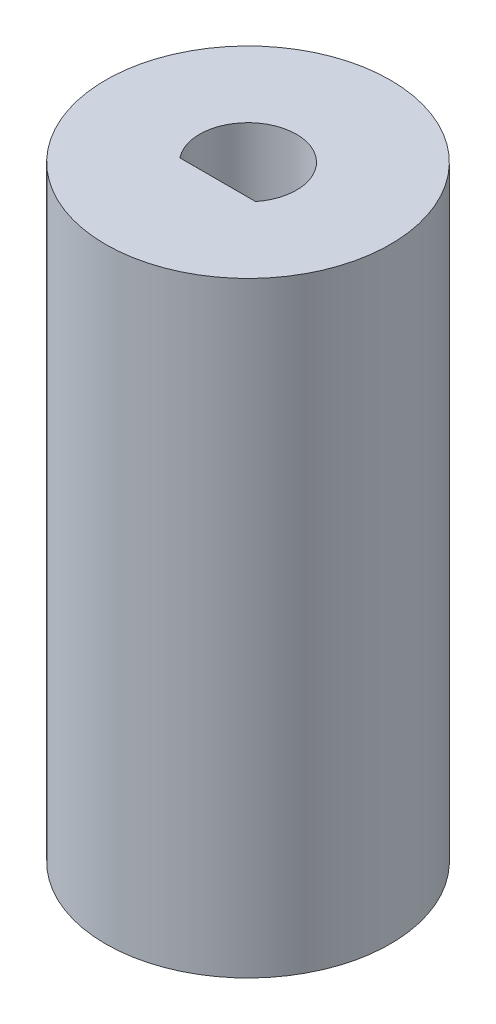
ISO-10303-21;
HEADER;
FILE_DESCRIPTION(('STEP AP214'),'2;1');
FILE_NAME('part.step','',(''),(''),'','','');
FILE_SCHEMA(('AUTOMOTIVE_DESIGN { 1 0 10303 214 1 1 1 1 }'));
ENDSEC;
DATA;
#1=APPLICATION_CONTEXT('core data for automotive mechanical design processes');
#2=APPLICATION_PROTOCOL_DEFINITION('international standard','automotive_design',2000,#1);
#3=PRODUCT_CONTEXT('',#1,'mechanical');
#4=PRODUCT('Part','Part','',(#3));
#5=PRODUCT_RELATED_PRODUCT_CATEGORY('part','',(#4));
#6=PRODUCT_DEFINITION_FORMATION('','',#4);
#7=PRODUCT_DEFINITION_CONTEXT('part definition',#1,'design');
#8=PRODUCT_DEFINITION('design','',#6,#7);
#9=PRODUCT_DEFINITION_SHAPE('','',#8);
#10=(LENGTH_UNIT() NAMED_UNIT(*) SI_UNIT(.MILLI.,.METRE.));
#11=(NAMED_UNIT(*) PLANE_ANGLE_UNIT() SI_UNIT($,.RADIAN.));
#12=(NAMED_UNIT(*) SI_UNIT($,.STERADIAN.) SOLID_ANGLE_UNIT());
#13=UNCERTAINTY_MEASURE_WITH_UNIT(LENGTH_MEASURE(1.E-05),#10,'distance_accuracy_value','');
#14=(GEOMETRIC_REPRESENTATION_CONTEXT(3) GLOBAL_UNCERTAINTY_ASSIGNED_CONTEXT((#13)) GLOBAL_UNIT_ASSIGNED_CONTEXT((#10,
#11,#12)) REPRESENTATION_CONTEXT('',''));
#15=CARTESIAN_POINT('',(0.,0.,0.));
#16=DIRECTION('',(0.,0.,1.));
#17=DIRECTION('',(1.,0.,0.));
#18=AXIS2_PLACEMENT_3D('',#15,#16,#17);
#19=CARTESIAN_POINT('',(0.,0.,0.));
#20=DIRECTION('',(0.,-1.,0.));
#21=DIRECTION('',(0.,0.,-1.));
#22=AXIS2_PLACEMENT_3D('',#19,#20,#21);
#23=CYLINDRICAL_SURFACE('',#22,0.848772605834894);
#24=CARTESIAN_POINT('',(0.,10.8595360807558,0.));
#25=DIRECTION('',(0.,-1.,0.));
#26=DIRECTION('',(0.,0.,-1.));
#27=AXIS2_PLACEMENT_3D('',#24,#25,#26);
#28=CIRCLE('',#27,0.848772605834894);
#29=CARTESIAN_POINT('',(0.,10.8595360807558,-0.848772605834894));
#30=VERTEX_POINT('',#29);
#31=EDGE_CURVE('E83',#30,#30,#28,.T.);
#32=ORIENTED_EDGE('',*,*,#31,.T.);
#33=EDGE_LOOP('',(#32));
#34=FACE_BOUND('',#33,.T.);
#35=CARTESIAN_POINT('',(0.,12.,0.));
#36=DIRECTION('',(0.,1.,0.));
#37=DIRECTION('',(0.,0.,1.));
#38=AXIS2_PLACEMENT_3D('',#35,#36,#37);
#39=CIRCLE('',#38,0.848772605834894);
#40=CARTESIAN_POINT('',(0.,12.,0.848772605834894));
#41=VERTEX_POINT('',#40);
#42=EDGE_CURVE('E37',#41,#41,#39,.F.);
#43=ORIENTED_EDGE('',*,*,#42,.F.);
#44=EDGE_LOOP('',(#43));
#45=FACE_BOUND('',#44,.T.);
#46=ADVANCED_FACE('F33',(#34,#45),#23,.F.);
#47=CARTESIAN_POINT('',(0.,0.,0.));
#48=DIRECTION('',(0.,-1.,0.));
#49=DIRECTION('',(0.,0.,-1.));
#50=AXIS2_PLACEMENT_3D('',#47,#48,#49);
#51=CYLINDRICAL_SURFACE('',#50,4.69999999999998);
#52=CARTESIAN_POINT('',(0.,0.,0.));
#53=DIRECTION('',(0.,-1.,0.));
#54=DIRECTION('',(0.,0.,-1.));
#55=AXIS2_PLACEMENT_3D('',#52,#53,#54);
#56=CIRCLE('',#55,4.69999999999998);
#57=CARTESIAN_POINT('',(0.,0.,-4.69999999999998));
#58=VERTEX_POINT('',#57);
#59=EDGE_CURVE('E11',#58,#58,#56,.T.);
#60=ORIENTED_EDGE('',*,*,#59,.F.);
#61=EDGE_LOOP('',(#60));
#62=FACE_BOUND('',#61,.T.);
#63=CARTESIAN_POINT('',(0.,20.,0.));
#64=DIRECTION('',(0.,-1.,0.));
#65=DIRECTION('',(0.,0.,-1.));
#66=AXIS2_PLACEMENT_3D('',#63,#64,#65);
#67=CIRCLE('',#66,4.69999999999998);
#68=CARTESIAN_POINT('',(0.,20.,-4.69999999999998));
#69=VERTEX_POINT('',#68);
#70=EDGE_CURVE('E80',#69,#69,#67,.T.);
#71=ORIENTED_EDGE('',*,*,#70,.T.);
#72=EDGE_LOOP('',(#71));
#73=FACE_BOUND('',#72,.T.);
#74=ADVANCED_FACE('F35',(#62,#73),#51,.T.);
#75=CARTESIAN_POINT('',(0.,0.,0.));
#76=DIRECTION('',(0.,1.,0.));
#77=DIRECTION('',(0.,0.,1.));
#78=AXIS2_PLACEMENT_3D('',#75,#76,#77);
#79=PLANE('',#78);
#80=CARTESIAN_POINT('',(0.,0.,0.));
#81=DIRECTION('',(0.,-1.,0.));
#82=DIRECTION('',(0.,0.,-1.));
#83=AXIS2_PLACEMENT_3D('',#80,#81,#82);
#84=CIRCLE('',#83,1.19999999999995);
#85=CARTESIAN_POINT('',(0.,0.,-1.19999999999995));
#86=VERTEX_POINT('',#85);
#87=EDGE_CURVE('E42',#86,#86,#84,.T.);
#88=ORIENTED_EDGE('',*,*,#87,.F.);
#89=EDGE_LOOP('',(#88));
#90=FACE_BOUND('',#89,.T.);
#91=ORIENTED_EDGE('',*,*,#59,.T.);
#92=EDGE_LOOP('',(#91));
#93=FACE_BOUND('',#92,.T.);
#94=ADVANCED_FACE('F94',(#90,#93),#79,.F.);
#95=CARTESIAN_POINT('',(0.,0.,0.));
#96=DIRECTION('',(0.,-1.,0.));
#97=DIRECTION('',(0.,0.,-1.));
#98=AXIS2_PLACEMENT_3D('',#95,#96,#97);
#99=CYLINDRICAL_SURFACE('',#98,1.19999999999995);
#100=CARTESIAN_POINT('',(0.,10.8595360807558,0.));
#101=DIRECTION('',(0.,-1.,0.));
#102=DIRECTION('',(0.,0.,-1.));
#103=AXIS2_PLACEMENT_3D('',#100,#101,#102);
#104=CIRCLE('',#103,1.19999999999995);
#105=CARTESIAN_POINT('',(0.,10.8595360807558,-1.19999999999995));
#106=VERTEX_POINT('',#105);
#107=EDGE_CURVE('E86',#106,#106,#104,.T.);
#108=ORIENTED_EDGE('',*,*,#107,.F.);
#109=EDGE_LOOP('',(#108));
#110=FACE_BOUND('',#109,.T.);
#111=ORIENTED_EDGE('',*,*,#87,.T.);
#112=EDGE_LOOP('',(#111));
#113=FACE_BOUND('',#112,.T.);
#114=ADVANCED_FACE('F92',(#110,#113),#99,.F.);
#115=CARTESIAN_POINT('',(0.,10.8595360807558,0.));
#116=DIRECTION('',(0.,1.,0.));
#117=DIRECTION('',(0.,0.,1.));
#118=AXIS2_PLACEMENT_3D('',#115,#116,#117);
#119=PLANE('',#118);
#120=ORIENTED_EDGE('',*,*,#31,.F.);
#121=EDGE_LOOP('',(#120));
#122=FACE_BOUND('',#121,.T.);
#123=ORIENTED_EDGE('',*,*,#107,.T.);
#124=EDGE_LOOP('',(#123));
#125=FACE_BOUND('',#124,.T.);
#126=ADVANCED_FACE('F104',(#122,#125),#119,.F.);
#127=CARTESIAN_POINT('',(0.,20.,0.));
#128=DIRECTION('',(0.,-1.,0.));
#129=DIRECTION('',(0.,0.,-1.));
#130=AXIS2_PLACEMENT_3D('',#127,#128,#129);
#131=PLANE('',#130);
#132=DIRECTION('',(1.,0.,0.));
#133=VECTOR('',#132,1.);
#134=CARTESIAN_POINT('',(0.,20.,1.));
#135=LINE('',#134,#133);
#136=CARTESIAN_POINT('',(-1.24899959967968,20.,1.));
#137=VERTEX_POINT('',#136);
#138=CARTESIAN_POINT('',(1.24899959967968,20.,1.));
#139=VERTEX_POINT('',#138);
#140=EDGE_CURVE('E68',#137,#139,#135,.T.);
#141=ORIENTED_EDGE('',*,*,#140,.F.);
#142=CARTESIAN_POINT('',(0.,20.,0.));
#143=DIRECTION('',(0.,1.,0.));
#144=DIRECTION('',(0.,0.,1.));
#145=AXIS2_PLACEMENT_3D('',#142,#143,#144);
#146=CIRCLE('',#145,1.6);
#147=EDGE_CURVE('E49',#139,#137,#146,.T.);
#148=ORIENTED_EDGE('',*,*,#147,.F.);
#149=EDGE_LOOP('',(#141,#148));
#150=FACE_BOUND('',#149,.T.);
#151=ORIENTED_EDGE('',*,*,#70,.F.);
#152=EDGE_LOOP('',(#151));
#153=FACE_BOUND('',#152,.T.);
#154=ADVANCED_FACE('F72',(#150,#153),#131,.F.);
#155=CARTESIAN_POINT('',(0.,12.,0.));
#156=DIRECTION('',(0.,1.,0.));
#157=DIRECTION('',(0.,0.,1.));
#158=AXIS2_PLACEMENT_3D('',#155,#156,#157);
#159=PLANE('',#158);
#160=CARTESIAN_POINT('',(0.,12.,0.));
#161=DIRECTION('',(0.,1.,0.));
#162=DIRECTION('',(0.,0.,1.));
#163=AXIS2_PLACEMENT_3D('',#160,#161,#162);
#164=CIRCLE('',#163,1.6);
#165=CARTESIAN_POINT('',(1.24899959967968,12.,1.));
#166=VERTEX_POINT('',#165);
#167=CARTESIAN_POINT('',(-1.24899959967968,12.,1.));
#168=VERTEX_POINT('',#167);
#169=EDGE_CURVE('E63',#166,#168,#164,.T.);
#170=ORIENTED_EDGE('',*,*,#169,.T.);
#171=DIRECTION('',(1.,0.,0.));
#172=VECTOR('',#171,1.);
#173=CARTESIAN_POINT('',(0.,12.,1.));
#174=LINE('',#173,#172);
#175=EDGE_CURVE('E76',#168,#166,#174,.T.);
#176=ORIENTED_EDGE('',*,*,#175,.T.);
#177=EDGE_LOOP('',(#170,#176));
#178=FACE_BOUND('',#177,.T.);
#179=ORIENTED_EDGE('',*,*,#42,.T.);
#180=EDGE_LOOP('',(#179));
#181=FACE_BOUND('',#180,.T.);
#182=ADVANCED_FACE('F103',(#178,#181),#159,.T.);
#183=CARTESIAN_POINT('',(0.,12.,0.));
#184=DIRECTION('',(0.,1.,0.));
#185=DIRECTION('',(0.,0.,1.));
#186=AXIS2_PLACEMENT_3D('',#183,#184,#185);
#187=CYLINDRICAL_SURFACE('',#186,1.6);
#188=ORIENTED_EDGE('',*,*,#147,.T.);
#189=DIRECTION('',(0.,1.,0.));
#190=VECTOR('',#189,1.);
#191=CARTESIAN_POINT('',(-1.24899959967968,12.,1.));
#192=LINE('',#191,#190);
#193=EDGE_CURVE('E65',#168,#137,#192,.T.);
#194=ORIENTED_EDGE('',*,*,#193,.F.);
#195=ORIENTED_EDGE('',*,*,#169,.F.);
#196=DIRECTION('',(0.,1.,0.));
#197=VECTOR('',#196,1.);
#198=CARTESIAN_POINT('',(1.24899959967968,12.,1.));
#199=LINE('',#198,#197);
#200=EDGE_CURVE('E57',#166,#139,#199,.T.);
#201=ORIENTED_EDGE('',*,*,#200,.T.);
#202=EDGE_LOOP('',(#188,#194,#195,#201));
#203=FACE_BOUND('',#202,.T.);
#204=ADVANCED_FACE('F61',(#203),#187,.F.);
#205=CARTESIAN_POINT('',(0.,12.,1.));
#206=DIRECTION('',(0.,0.,1.));
#207=DIRECTION('',(1.,0.,0.));
#208=AXIS2_PLACEMENT_3D('',#205,#206,#207);
#209=PLANE('',#208);
#210=ORIENTED_EDGE('',*,*,#140,.T.);
#211=ORIENTED_EDGE('',*,*,#200,.F.);
#212=ORIENTED_EDGE('',*,*,#175,.F.);
#213=ORIENTED_EDGE('',*,*,#193,.T.);
#214=EDGE_LOOP('',(#210,#211,#212,#213));
#215=FACE_BOUND('',#214,.T.);
#216=ADVANCED_FACE('F69',(#215),#209,.F.);
#217=CLOSED_SHELL('',(#46,#74,#94,#114,#126,#154,#182,#204,#216));
#218=MANIFOLD_SOLID_BREP('B2',#217);
#219=ADVANCED_BREP_SHAPE_REPRESENTATION('',(#18,#218),#14);
#220=SHAPE_DEFINITION_REPRESENTATION(#9,#219);
ENDSEC;
END-ISO-10303-21;
